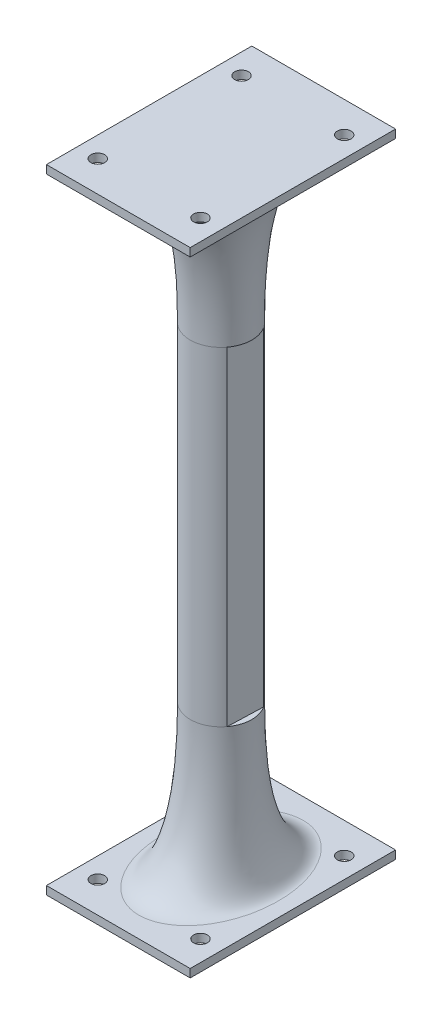
ISO-10303-21;
HEADER;
FILE_DESCRIPTION(('STEP AP214'),'2;1');
FILE_NAME('part.step','',(''),(''),'','','');
FILE_SCHEMA(('AUTOMOTIVE_DESIGN { 1 0 10303 214 1 1 1 1 }'));
ENDSEC;
DATA;
#1=APPLICATION_CONTEXT('core data for automotive mechanical design processes');
#2=APPLICATION_PROTOCOL_DEFINITION('international standard','automotive_design',2000,#1);
#3=PRODUCT_CONTEXT('',#1,'mechanical');
#4=PRODUCT('Part','Part','',(#3));
#5=PRODUCT_RELATED_PRODUCT_CATEGORY('part','',(#4));
#6=PRODUCT_DEFINITION_FORMATION('','',#4);
#7=PRODUCT_DEFINITION_CONTEXT('part definition',#1,'design');
#8=PRODUCT_DEFINITION('design','',#6,#7);
#9=PRODUCT_DEFINITION_SHAPE('','',#8);
#10=(LENGTH_UNIT() NAMED_UNIT(*) SI_UNIT(.MILLI.,.METRE.));
#11=(NAMED_UNIT(*) PLANE_ANGLE_UNIT() SI_UNIT($,.RADIAN.));
#12=(NAMED_UNIT(*) SI_UNIT($,.STERADIAN.) SOLID_ANGLE_UNIT());
#13=UNCERTAINTY_MEASURE_WITH_UNIT(LENGTH_MEASURE(1.E-05),#10,'distance_accuracy_value','');
#14=(GEOMETRIC_REPRESENTATION_CONTEXT(3) GLOBAL_UNCERTAINTY_ASSIGNED_CONTEXT((#13)) GLOBAL_UNIT_ASSIGNED_CONTEXT((#10,
#11,#12)) REPRESENTATION_CONTEXT('',''));
#15=CARTESIAN_POINT('',(0.,0.,0.));
#16=DIRECTION('',(0.,0.,1.));
#17=DIRECTION('',(1.,0.,0.));
#18=AXIS2_PLACEMENT_3D('',#15,#16,#17);
#19=CARTESIAN_POINT('',(0.,77.,0.));
#20=DIRECTION('',(0.,-1.,0.));
#21=DIRECTION('',(0.,0.,-1.));
#22=AXIS2_PLACEMENT_3D('',#19,#20,#21);
#23=CYLINDRICAL_SURFACE('',#22,7.5);
#24=DIRECTION('',(0.,1.,0.));
#25=VECTOR('',#24,1.);
#26=CARTESIAN_POINT('',(6.00000000000016,-6.70935965365545,4.49999999999978));
#27=LINE('',#26,#25);
#28=CARTESIAN_POINT('',(5.99835042648636,37.,4.50118253100853));
#29=VERTEX_POINT('',#28);
#30=CARTESIAN_POINT('',(5.99835042648636,117.,4.50118253100853));
#31=VERTEX_POINT('',#30);
#32=EDGE_CURVE('E188',#29,#31,#27,.T.);
#33=ORIENTED_EDGE('',*,*,#32,.T.);
#34=CARTESIAN_POINT('',(0.347546737118989,117.,7.49194309011474));
#35=CARTESIAN_POINT('',(0.554292529365187,117.,7.48235227707145));
#36=CARTESIAN_POINT('',(0.963116018477651,117.,7.44656594368198));
#37=CARTESIAN_POINT('',(1.56050234554119,117.,7.34509640919193));
#38=CARTESIAN_POINT('',(2.14019514553421,117.,7.19786092779885));
#39=CARTESIAN_POINT('',(5.50112306027701,117.,6.05199688303917));
#40=CARTESIAN_POINT('',(7.64539609880735,117.,2.96038593882019));
#41=CARTESIAN_POINT('',(7.30012682924897,117.,-4.48246258204297));
#42=CARTESIAN_POINT('',(3.78736910780499,117.,-7.6837593509805));
#43=CARTESIAN_POINT('',(-4.48246258204297,117.,-7.30012682924897));
#44=CARTESIAN_POINT('',(-7.6837593509805,117.,-3.78736910780499));
#45=CARTESIAN_POINT('',(-7.33849008142212,117.,3.65547941305817));
#46=CARTESIAN_POINT('',(-4.91720606649304,117.,6.53529690957277));
#47=CARTESIAN_POINT('',(-1.46462876505931,117.,7.36508654242857));
#48=CARTESIAN_POINT('',(-0.873794580459681,117.,7.45802198052024));
#49=CARTESIAN_POINT('',(-0.269579849002208,117.,7.50374996409558));
#50=CARTESIAN_POINT('',(0.14080094487279,117.,7.50153390315802));
#51=CARTESIAN_POINT('',(0.347546737118989,117.,7.49194309011474));
#52=B_SPLINE_CURVE_WITH_KNOTS('',3,(#34,#35,#36,#37,#38,#39,#40,#41,#42,#43,#44,#45,#46,#47,#48,
#49,#50,#51),.UNSPECIFIED.,.T.,.F.,(4,1,1,1,1,2,2,2,1,1,1,1,4),(0.,0.0125,0.0249999999999999,
0.0375000000000001,0.05,0.25,0.5,0.75,0.95,0.9625,0.975,0.9875,1.),.UNSPECIFIED.);
#53=CARTESIAN_POINT('',(6.29367200133954,117.,-4.07923195769015));
#54=VERTEX_POINT('',#53);
#55=EDGE_CURVE('E202',#54,#31,#52,.T.);
#56=ORIENTED_EDGE('',*,*,#55,.F.);
#57=DIRECTION('',(0.,1.,0.));
#58=VECTOR('',#57,1.);
#59=CARTESIAN_POINT('',(6.29364739917343,-6.70935965365545,-4.079215906872));
#60=LINE('',#59,#58);
#61=CARTESIAN_POINT('',(6.29367200133954,37.,-4.07923195769015));
#62=VERTEX_POINT('',#61);
#63=EDGE_CURVE('E179',#62,#54,#60,.T.);
#64=ORIENTED_EDGE('',*,*,#63,.F.);
#65=CARTESIAN_POINT('',(0.,37.,0.));
#66=DIRECTION('',(0.,1.,0.));
#67=DIRECTION('',(0.,0.,1.));
#68=AXIS2_PLACEMENT_3D('',#65,#66,#67);
#69=CIRCLE('',#68,7.5);
#70=EDGE_CURVE('E100',#62,#29,#69,.T.);
#71=ORIENTED_EDGE('',*,*,#70,.T.);
#72=EDGE_LOOP('',(#33,#56,#64,#71));
#73=FACE_BOUND('',#72,.T.);
#74=ADVANCED_FACE('F91',(#73),#23,.T.);
#75=CARTESIAN_POINT('',(-0.239361653243309,2.,19.9970766230281));
#76=CARTESIAN_POINT('',(-0.194900534208958,2.,18.1770053121313));
#77=CARTESIAN_POINT('',(0.347546737118989,3.54562077740665,7.49194309011474));
#78=CARTESIAN_POINT('',(0.347546737118989,37.,7.49194309011474));
#79=CARTESIAN_POINT('',(0.146922382755795,2.,20.0065128579728));
#80=CARTESIAN_POINT('',(0.12055254740084,2.,18.1844203422382));
#81=CARTESIAN_POINT('',(0.554292529365187,3.54242986405842,7.48235227707145));
#82=CARTESIAN_POINT('',(0.554292529365187,37.,7.48235227707145));
#83=CARTESIAN_POINT('',(0.912759687554871,2.,19.9804058575668));
#84=CARTESIAN_POINT('',(0.745996902826354,2.,18.1640755567274));
#85=CARTESIAN_POINT('',(0.963116018477651,3.54219328401773,7.44656594368198));
#86=CARTESIAN_POINT('',(0.963116018477651,37.,7.44656594368198));
#87=CARTESIAN_POINT('',(2.03764739324277,2.,19.8113817285791));
#88=CARTESIAN_POINT('',(1.66558078654985,2.,18.0317426474941));
#89=CARTESIAN_POINT('',(1.56050234554119,3.55991363590714,7.34509640919193));
#90=CARTESIAN_POINT('',(1.56050234554119,37.,7.34509640919193));
#91=CARTESIAN_POINT('',(3.13499089750662,2.,19.51756875372));
#92=CARTESIAN_POINT('',(2.57105150628861,2.,17.7983320551637));
#93=CARTESIAN_POINT('',(2.14019514553421,3.59480360694861,7.19786092779885));
#94=CARTESIAN_POINT('',(2.14019514553421,37.,7.19786092779885));
#95=CARTESIAN_POINT('',(9.53173101506544,2.,17.0364065243815));
#96=CARTESIAN_POINT('',(7.9286029257289,2.,15.8185927378217));
#97=CARTESIAN_POINT('',(5.50112306027701,3.89755737688528,6.05199688303917));
#98=CARTESIAN_POINT('',(5.50112306027701,37.,6.05199688303917));
#99=CARTESIAN_POINT('',(13.8922678047397,2.,9.17129461318427));
#100=CARTESIAN_POINT('',(12.1378154535903,2.,8.50187874577093));
#101=CARTESIAN_POINT('',(7.64539609880735,4.92554845236295,2.96038593882019));
#102=CARTESIAN_POINT('',(7.64539609880735,37.,2.96038593882019));
#103=CARTESIAN_POINT('',(14.1300609253447,2.,-10.6947415239126));
#104=CARTESIAN_POINT('',(12.7279968794355,2.,-9.901771494181));
#105=CARTESIAN_POINT('',(7.30012682924897,4.99044989110801,-4.48246258204297));
#106=CARTESIAN_POINT('',(7.30012682924897,37.,-4.48246258204297));
#107=CARTESIAN_POINT('',(7.96504237322541,2.,-19.8083519241353));
#108=CARTESIAN_POINT('',(7.22599938800304,2.,-17.9938670511293));
#109=CARTESIAN_POINT('',(3.78736910780499,3.55982510795444,-7.6837593509805));
#110=CARTESIAN_POINT('',(3.78736910780499,37.,-7.6837593509805));
#111=CARTESIAN_POINT('',(-7.48631906673879,2.,-20.185801321921));
#112=CARTESIAN_POINT('',(-6.83867291607583,2.,-18.360194816183));
#113=CARTESIAN_POINT('',(-4.48246258204297,3.53141644685886,-7.30012682924897));
#114=CARTESIAN_POINT('',(-4.48246258204297,37.,-7.30012682924897));
#115=CARTESIAN_POINT('',(-13.8658463468947,2.,-11.3786319617506));
#116=CARTESIAN_POINT('',(-12.4945321210332,2.,-10.5634186665552));
#117=CARTESIAN_POINT('',(-7.6837593509805,4.93363256891686,-3.78736910780499));
#118=CARTESIAN_POINT('',(-7.6837593509805,37.,-3.78736910780499));
#119=CARTESIAN_POINT('',(-14.1036394674997,2.,8.48740417534624));
#120=CARTESIAN_POINT('',(-12.3245939598601,2.,7.87293851790129));
#121=CARTESIAN_POINT('',(-7.33849008142212,4.97100231011586,3.65547941305817));
#122=CARTESIAN_POINT('',(-7.33849008142212,37.,3.65547941305817));
#123=CARTESIAN_POINT('',(-9.93388509122683,2.,16.5608959937791));
#124=CARTESIAN_POINT('',(-8.30036228521085,2.,15.4182706097587));
#125=CARTESIAN_POINT('',(-4.91720606649304,4.04925962713558,6.53529690957277));
#126=CARTESIAN_POINT('',(-4.91720606649304,37.,6.53529690957277));
#127=CARTESIAN_POINT('',(-3.60026554530373,2.,19.3530383660161));
#128=CARTESIAN_POINT('',(-2.95663820492342,2.,17.6663172880339));
#129=CARTESIAN_POINT('',(-1.46462876505931,3.64932164517998,7.36508654242857));
#130=CARTESIAN_POINT('',(-1.46462876505931,37.,7.36508654242857));
#131=CARTESIAN_POINT('',(-2.5105953118666,2.,19.7002762135928));
#132=CARTESIAN_POINT('',(-2.05282748186925,2.,17.9437684218622));
#133=CARTESIAN_POINT('',(-0.873794580459681,3.5973829952733,7.45802198052024));
#134=CARTESIAN_POINT('',(-0.873794580459681,37.,7.45802198052024));
#135=CARTESIAN_POINT('',(-1.39041045040131,2.,19.9241434896876));
#136=CARTESIAN_POINT('',(-1.13218750879399,2.,18.1199404178743));
#137=CARTESIAN_POINT('',(-0.269579849002208,3.5613387641071,7.50374996409558));
#138=CARTESIAN_POINT('',(-0.269579849002208,37.,7.50374996409558));
#139=CARTESIAN_POINT('',(-0.625645689242413,2.,19.9876403880835));
#140=CARTESIAN_POINT('',(-0.510353615818757,2.,18.1695902820243));
#141=CARTESIAN_POINT('',(0.14080094487279,3.54881169075487,7.50153390315802));
#142=CARTESIAN_POINT('',(0.14080094487279,37.,7.50153390315802));
#143=CARTESIAN_POINT('',(-0.239361653243309,2.,19.9970766230281));
#144=CARTESIAN_POINT('',(-0.194900534208958,2.,18.1770053121313));
#145=CARTESIAN_POINT('',(0.347546737118989,3.54562077740665,7.49194309011474));
#146=CARTESIAN_POINT('',(0.347546737118989,37.,7.49194309011474));
#147=B_SPLINE_SURFACE_WITH_KNOTS('',3,3,((#75,#76,#77,#78),(#79,#80,#81,#82),(#83,#84,#85,#86),
(#87,#88,#89,#90),(#91,#92,#93,#94),(#95,#96,#97,#98),(#99,#100,#101,#102),(#103,#104,#105,
#106),(#107,#108,#109,#110),(#111,#112,#113,#114),(#115,#116,#117,#118),(#119,#120,#121,#122),
(#123,#124,#125,#126),(#127,#128,#129,#130),(#131,#132,#133,#134),(#135,#136,#137,#138),(#139,
#140,#141,#142),(#143,#144,#145,#146)),.UNSPECIFIED.,.T.,.F.,.F.,(4,1,1,1,1,2,2,2,1,1,1,1,4),(4,
4),(0.,0.0125,0.0249999999999999,0.0375000000000001,0.05,0.25,0.5,0.75,0.95,0.9625,0.975,0.9875,
1.),(0.,1.),.UNSPECIFIED.);
#148=CARTESIAN_POINT('',(0.,2.,0.));
#149=DIRECTION('',(0.,1.,0.));
#150=DIRECTION('',(0.,0.,-1.));
#151=AXIS2_PLACEMENT_3D('',#148,#149,#150);
#152=ELLIPSE('',#151,20.,14.);
#153=CARTESIAN_POINT('',(0.,2.,-20.));
#154=VERTEX_POINT('',#153);
#155=EDGE_CURVE('E440',#154,#154,#152,.F.);
#156=EDGE_CURVE('E14',#29,#62,#69,.T.);
#157=CARTESIAN_POINT('',(-0.239480364431131,2.,20.0019362134282));
#158=CARTESIAN_POINT('',(-0.23944079403519,2.,20.0003163499615));
#159=CARTESIAN_POINT('',(-0.239401223639249,2.,19.9986964864948));
#160=CARTESIAN_POINT('',(-0.239361653243309,2.,19.9970766230281));
#161=CARTESIAN_POINT('',(-0.194900534208958,2.,18.1770053121313));
#162=CARTESIAN_POINT('',(0.347546737118989,3.54562077740665,7.49194309011474));
#163=CARTESIAN_POINT('',(0.347546737118989,37.,7.49194309011474));
#164=CARTESIAN_POINT('',(0.146992790216193,2.,20.0113778449898));
#165=CARTESIAN_POINT('',(0.146969321062727,2.,20.0097561826508));
#166=CARTESIAN_POINT('',(0.146945851909261,2.,20.0081345203118));
#167=CARTESIAN_POINT('',(0.146922382755795,2.,20.0065128579728));
#168=CARTESIAN_POINT('',(0.12055254740084,2.,18.1844203422382));
#169=CARTESIAN_POINT('',(0.554292529365187,3.54242986405842,7.48235227707145));
#170=CARTESIAN_POINT('',(0.554292529365187,37.,7.48235227707145));
#171=CARTESIAN_POINT('',(0.913204944190097,2.,19.98525545947));
#172=CARTESIAN_POINT('',(0.913056525311688,2.,19.9836389255022));
#173=CARTESIAN_POINT('',(0.91290810643328,2.,19.9820223915345));
#174=CARTESIAN_POINT('',(0.912759687554871,2.,19.9804058575668));
#175=CARTESIAN_POINT('',(0.745996902826354,2.,18.1640755567274));
#176=CARTESIAN_POINT('',(0.963116018477651,3.54219328401773,7.44656594368198));
#177=CARTESIAN_POINT('',(0.963116018477651,37.,7.44656594368198));
#178=CARTESIAN_POINT('',(2.03864081108264,2.,19.8161333649256));
#179=CARTESIAN_POINT('',(2.03830967180268,2.,19.8145494861434));
#180=CARTESIAN_POINT('',(2.03797853252273,2.,19.8129656073612));
#181=CARTESIAN_POINT('',(2.03764739324277,2.,19.8113817285791));
#182=CARTESIAN_POINT('',(1.66558078654985,2.,18.0317426474941));
#183=CARTESIAN_POINT('',(1.56050234554119,3.55991363590714,7.34509640919193));
#184=CARTESIAN_POINT('',(1.56050234554119,37.,7.34509640919193));
#185=CARTESIAN_POINT('',(3.13649661568117,2.,19.5221591157052));
#186=CARTESIAN_POINT('',(3.13599470962299,2.,19.5206289950434));
#187=CARTESIAN_POINT('',(3.13549280356481,2.,19.5190988743817));
#188=CARTESIAN_POINT('',(3.13499089750662,2.,19.51756875372));
#189=CARTESIAN_POINT('',(2.57105150628861,2.,17.7983320551637));
#190=CARTESIAN_POINT('',(2.14019514553421,3.59480360694861,7.19786092779885));
#191=CARTESIAN_POINT('',(2.14019514553421,37.,7.19786092779885));
#192=CARTESIAN_POINT('',(9.53601136706397,2.,17.0396580871916));
#193=CARTESIAN_POINT('',(9.53458458306446,2.,17.0385742329216));
#194=CARTESIAN_POINT('',(9.53315779906495,2.,17.0374903786515));
#195=CARTESIAN_POINT('',(9.53173101506544,2.,17.0364065243815));
#196=CARTESIAN_POINT('',(7.9286029257289,2.,15.8185927378217));
#197=CARTESIAN_POINT('',(5.50112306027701,3.89755737688528,6.05199688303917));
#198=CARTESIAN_POINT('',(5.50112306027701,37.,6.05199688303917));
#199=CARTESIAN_POINT('',(13.8969521925173,2.,9.17308195355026));
#200=CARTESIAN_POINT('',(13.8953907299248,2.,9.17248617342826));
#201=CARTESIAN_POINT('',(13.8938292673322,2.,9.17189039330627));
#202=CARTESIAN_POINT('',(13.8922678047397,2.,9.17129461318427));
#203=CARTESIAN_POINT('',(12.1378154535903,2.,8.50187874577093));
#204=CARTESIAN_POINT('',(7.64539609880735,4.92554845236295,2.96038593882019));
#205=CARTESIAN_POINT('',(7.64539609880735,37.,2.96038593882019));
#206=CARTESIAN_POINT('',(14.1338044363473,2.,-10.6968587538919));
#207=CARTESIAN_POINT('',(14.1325565993464,2.,-10.6961530105655));
#208=CARTESIAN_POINT('',(14.1313087623455,2.,-10.695447267239));
#209=CARTESIAN_POINT('',(14.1300609253447,2.,-10.6947415239126));
#210=CARTESIAN_POINT('',(12.7279968794355,2.,-9.901771494181));
#211=CARTESIAN_POINT('',(7.30012682924897,4.99044989110801,-4.48246258204297));
#212=CARTESIAN_POINT('',(7.30012682924897,37.,-4.48246258204297));
#213=CARTESIAN_POINT('',(7.96701561799595,2.,-19.8131965987462));
#214=CARTESIAN_POINT('',(7.96635786973911,2.,-19.8115817072092));
#215=CARTESIAN_POINT('',(7.96570012148226,2.,-19.8099668156723));
#216=CARTESIAN_POINT('',(7.96504237322541,2.,-19.8083519241353));
#217=CARTESIAN_POINT('',(7.22599938800304,2.,-17.9938670511293));
#218=CARTESIAN_POINT('',(3.78736910780499,3.55982510795444,-7.6837593509805));
#219=CARTESIAN_POINT('',(3.78736910780499,37.,-7.6837593509805));
#220=CARTESIAN_POINT('',(-7.48804828196106,2.,-20.1906756912913));
#221=CARTESIAN_POINT('',(-7.48747187688697,2.,-20.1890509015012));
#222=CARTESIAN_POINT('',(-7.48689547181288,2.,-20.1874261117111));
#223=CARTESIAN_POINT('',(-7.48631906673879,2.,-20.185801321921));
#224=CARTESIAN_POINT('',(-6.83867291607583,2.,-18.360194816183));
#225=CARTESIAN_POINT('',(-4.48246258204297,3.53141644685886,-7.30012682924897));
#226=CARTESIAN_POINT('',(-4.48246258204297,37.,-7.30012682924897));
#227=CARTESIAN_POINT('',(-13.8695077558778,2.,-11.3808085812488));
#228=CARTESIAN_POINT('',(-13.8682872862167,2.,-11.380083041416));
#229=CARTESIAN_POINT('',(-13.8670668165557,2.,-11.3793575015833));
#230=CARTESIAN_POINT('',(-13.8658463468947,2.,-11.3786319617506));
#231=CARTESIAN_POINT('',(-12.4945321210332,2.,-10.5634186665552));
#232=CARTESIAN_POINT('',(-7.6837593509805,4.93363256891686,-3.78736910780499));
#233=CARTESIAN_POINT('',(-7.6837593509805,37.,-3.78736910780499));
#234=CARTESIAN_POINT('',(-14.1083895190051,2.,8.48904479865161));
#235=CARTESIAN_POINT('',(-14.1068061685033,2.,8.48849792421649));
#236=CARTESIAN_POINT('',(-14.1052228180015,2.,8.48795104978136));
#237=CARTESIAN_POINT('',(-14.1036394674997,2.,8.48740417534624));
#238=CARTESIAN_POINT('',(-12.3245939598601,2.,7.87293851790129));
#239=CARTESIAN_POINT('',(-7.33849008142212,4.97100231011586,3.65547941305817));
#240=CARTESIAN_POINT('',(-7.33849008142212,37.,3.65547941305817));
#241=CARTESIAN_POINT('',(-9.93824659711889,2.,16.5639468035544));
#242=CARTESIAN_POINT('',(-9.93679276182154,2.,16.5629298669626));
#243=CARTESIAN_POINT('',(-9.93533892652419,2.,16.5619129303708));
#244=CARTESIAN_POINT('',(-9.93388509122683,2.,16.5608959937791));
#245=CARTESIAN_POINT('',(-8.30036228521085,2.,15.4182706097587));
#246=CARTESIAN_POINT('',(-4.91720606649304,4.04925962713558,6.53529690957277));
#247=CARTESIAN_POINT('',(-4.91720606649304,37.,6.53529690957277));
#248=CARTESIAN_POINT('',(-3.60198403030254,2.,19.3575419112943));
#249=CARTESIAN_POINT('',(-3.60141120196961,2.,19.3560407295349));
#250=CARTESIAN_POINT('',(-3.60083837363667,2.,19.3545395477755));
#251=CARTESIAN_POINT('',(-3.60026554530373,2.,19.3530383660161));
#252=CARTESIAN_POINT('',(-2.95663820492342,2.,17.6663172880339));
#253=CARTESIAN_POINT('',(-1.46462876505931,3.64932164517998,7.36508654242857));
#254=CARTESIAN_POINT('',(-1.46462876505931,37.,7.36508654242857));
#255=CARTESIAN_POINT('',(-2.51181755197269,2.,19.7049660893967));
#256=CARTESIAN_POINT('',(-2.51141013860399,2.,19.703402797462));
#257=CARTESIAN_POINT('',(-2.5110027252353,2.,19.7018395055274));
#258=CARTESIAN_POINT('',(-2.5105953118666,2.,19.7002762135928));
#259=CARTESIAN_POINT('',(-2.05282748186925,2.,17.9437684218622));
#260=CARTESIAN_POINT('',(-0.873794580459681,3.5973829952733,7.45802198052024));
#261=CARTESIAN_POINT('',(-0.873794580459681,37.,7.45802198052024));
#262=CARTESIAN_POINT('',(-1.3910999056554,2.,19.9289607118893));
#263=CARTESIAN_POINT('',(-1.39087008723737,2.,19.9273549711554));
#264=CARTESIAN_POINT('',(-1.39064026881934,2.,19.9257492304215));
#265=CARTESIAN_POINT('',(-1.39041045040131,2.,19.9241434896876));
#266=CARTESIAN_POINT('',(-1.13218750879399,2.,18.1199404178743));
#267=CARTESIAN_POINT('',(-0.269579849002208,3.5613387641071,7.50374996409558));
#268=CARTESIAN_POINT('',(-0.269579849002208,37.,7.50374996409558));
#269=CARTESIAN_POINT('',(-0.625953519078454,2.,19.9924945818667));
#270=CARTESIAN_POINT('',(-0.625850909133107,2.,19.9908765172723));
#271=CARTESIAN_POINT('',(-0.62574829918776,2.,19.9892584526779));
#272=CARTESIAN_POINT('',(-0.625645689242413,2.,19.9876403880835));
#273=CARTESIAN_POINT('',(-0.510353615818757,2.,18.1695902820243));
#274=CARTESIAN_POINT('',(0.14080094487279,3.54881169075487,7.50153390315802));
#275=CARTESIAN_POINT('',(0.14080094487279,37.,7.50153390315802));
#276=CARTESIAN_POINT('',(-0.239480364431131,2.,20.0019362134282));
#277=CARTESIAN_POINT('',(-0.23944079403519,2.,20.0003163499615));
#278=CARTESIAN_POINT('',(-0.239401223639249,2.,19.9986964864948));
#279=CARTESIAN_POINT('',(-0.239361653243309,2.,19.9970766230281));
#280=CARTESIAN_POINT('',(-0.194900534208958,2.,18.1770053121313));
#281=CARTESIAN_POINT('',(0.347546737118989,3.54562077740665,7.49194309011474));
#282=CARTESIAN_POINT('',(0.347546737118989,37.,7.49194309011474));
#283=B_SPLINE_SURFACE_WITH_KNOTS('',3,3,((#157,#158,#159,#160,#161,#162,#163),(#164,#165,#166,
#167,#168,#169,#170),(#171,#172,#173,#174,#175,#176,#177),(#178,#179,#180,#181,#182,#183,#184),
(#185,#186,#187,#188,#189,#190,#191),(#192,#193,#194,#195,#196,#197,#198),(#199,#200,#201,#202,
#203,#204,#205),(#206,#207,#208,#209,#210,#211,#212),(#213,#214,#215,#216,#217,#218,#219),(#220,
#221,#222,#223,#224,#225,#226),(#227,#228,#229,#230,#231,#232,#233),(#234,#235,#236,#237,#238,
#239,#240),(#241,#242,#243,#244,#245,#246,#247),(#248,#249,#250,#251,#252,#253,#254),(#255,#256,
#257,#258,#259,#260,#261),(#262,#263,#264,#265,#266,#267,#268),(#269,#270,#271,#272,#273,#274,
#275),(#276,#277,#278,#279,#280,#281,#282)),.UNSPECIFIED.,.T.,.F.,.F.,(4,1,1,1,1,2,2,2,1,1,1,1,
4),(4,3,4),(0.,0.0125,0.0249999999999999,0.0375000000000001,0.05,0.25,0.5,0.75,0.95,0.9625,
0.975,0.9875,1.),(-0.00089,0.,1.),.UNSPECIFIED.);
#284=ORIENTED_EDGE('',*,*,#155,.F.);
#285=EDGE_LOOP('',(#284));
#286=FACE_BOUND('',#285,.T.);
#287=ORIENTED_EDGE('',*,*,#156,.F.);
#288=ORIENTED_EDGE('',*,*,#70,.F.);
#289=EDGE_LOOP('',(#287,#288));
#290=FACE_BOUND('',#289,.T.);
#291=ADVANCED_FACE('F370',(#286,#290),#283,.T.);
#292=CARTESIAN_POINT('',(0.,2.,0.));
#293=DIRECTION('',(0.,1.,0.));
#294=DIRECTION('',(0.,0.,1.));
#295=AXIS2_PLACEMENT_3D('',#292,#293,#294);
#296=PLANE('',#295);
#297=CARTESIAN_POINT('',(12.5,2.,17.5));
#298=DIRECTION('',(0.,1.,0.));
#299=DIRECTION('',(0.,0.,1.));
#300=AXIS2_PLACEMENT_3D('',#297,#298,#299);
#301=CIRCLE('',#300,1.675);
#302=CARTESIAN_POINT('',(12.5,2.,19.175));
#303=VERTEX_POINT('',#302);
#304=EDGE_CURVE('E197',#303,#303,#301,.T.);
#305=ORIENTED_EDGE('',*,*,#304,.F.);
#306=EDGE_LOOP('',(#305));
#307=FACE_BOUND('',#306,.T.);
#308=CARTESIAN_POINT('',(12.5,2.,-17.5));
#309=DIRECTION('',(0.,1.,0.));
#310=DIRECTION('',(0.,0.,1.));
#311=AXIS2_PLACEMENT_3D('',#308,#309,#310);
#312=CIRCLE('',#311,1.675);
#313=CARTESIAN_POINT('',(12.5,2.,-15.825));
#314=VERTEX_POINT('',#313);
#315=EDGE_CURVE('E235',#314,#314,#312,.T.);
#316=ORIENTED_EDGE('',*,*,#315,.F.);
#317=EDGE_LOOP('',(#316));
#318=FACE_BOUND('',#317,.T.);
#319=CARTESIAN_POINT('',(-12.5,2.,-17.5));
#320=DIRECTION('',(0.,1.,0.));
#321=DIRECTION('',(0.,0.,1.));
#322=AXIS2_PLACEMENT_3D('',#319,#320,#321);
#323=CIRCLE('',#322,1.675);
#324=CARTESIAN_POINT('',(-12.5,2.,-15.825));
#325=VERTEX_POINT('',#324);
#326=EDGE_CURVE('E231',#325,#325,#323,.T.);
#327=ORIENTED_EDGE('',*,*,#326,.F.);
#328=EDGE_LOOP('',(#327));
#329=FACE_BOUND('',#328,.T.);
#330=CARTESIAN_POINT('',(-12.5,2.,17.5));
#331=DIRECTION('',(0.,1.,0.));
#332=DIRECTION('',(0.,0.,1.));
#333=AXIS2_PLACEMENT_3D('',#330,#331,#332);
#334=CIRCLE('',#333,1.675);
#335=CARTESIAN_POINT('',(-12.5,2.,19.175));
#336=VERTEX_POINT('',#335);
#337=EDGE_CURVE('E227',#336,#336,#334,.T.);
#338=ORIENTED_EDGE('',*,*,#337,.F.);
#339=EDGE_LOOP('',(#338));
#340=FACE_BOUND('',#339,.T.);
#341=DIRECTION('',(0.,0.,-1.));
#342=VECTOR('',#341,1.);
#343=CARTESIAN_POINT('',(17.5,2.,-25.));
#344=LINE('',#343,#342);
#345=CARTESIAN_POINT('',(17.5,2.,25.));
#346=VERTEX_POINT('',#345);
#347=CARTESIAN_POINT('',(17.5,2.,-25.));
#348=VERTEX_POINT('',#347);
#349=EDGE_CURVE('E484',#346,#348,#344,.T.);
#350=ORIENTED_EDGE('',*,*,#349,.T.);
#351=DIRECTION('',(-1.,0.,0.));
#352=VECTOR('',#351,1.);
#353=CARTESIAN_POINT('',(-17.5,2.,-25.));
#354=LINE('',#353,#352);
#355=CARTESIAN_POINT('',(-17.5,2.,-25.));
#356=VERTEX_POINT('',#355);
#357=EDGE_CURVE('E144',#348,#356,#354,.T.);
#358=ORIENTED_EDGE('',*,*,#357,.T.);
#359=DIRECTION('',(0.,0.,1.));
#360=VECTOR('',#359,1.);
#361=CARTESIAN_POINT('',(-17.5,2.,-25.));
#362=LINE('',#361,#360);
#363=CARTESIAN_POINT('',(-17.5,2.,25.));
#364=VERTEX_POINT('',#363);
#365=EDGE_CURVE('E480',#356,#364,#362,.T.);
#366=ORIENTED_EDGE('',*,*,#365,.T.);
#367=DIRECTION('',(1.,0.,0.));
#368=VECTOR('',#367,1.);
#369=CARTESIAN_POINT('',(-17.5,2.,25.));
#370=LINE('',#369,#368);
#371=EDGE_CURVE('E115',#364,#346,#370,.T.);
#372=ORIENTED_EDGE('',*,*,#371,.T.);
#373=EDGE_LOOP('',(#350,#358,#366,#372));
#374=FACE_BOUND('',#373,.T.);
#375=ORIENTED_EDGE('',*,*,#155,.T.);
#376=EDGE_LOOP('',(#375));
#377=FACE_BOUND('',#376,.T.);
#378=ADVANCED_FACE('F374',(#307,#318,#329,#340,#374,#377),#296,.T.);
#379=CARTESIAN_POINT('',(17.5,2.,-25.));
#380=DIRECTION('',(-1.,0.,0.));
#381=DIRECTION('',(0.,0.,1.));
#382=AXIS2_PLACEMENT_3D('',#379,#380,#381);
#383=PLANE('',#382);
#384=DIRECTION('',(0.,0.,-1.));
#385=VECTOR('',#384,1.);
#386=CARTESIAN_POINT('',(17.5,0.,-25.));
#387=LINE('',#386,#385);
#388=CARTESIAN_POINT('',(17.5,0.,25.));
#389=VERTEX_POINT('',#388);
#390=CARTESIAN_POINT('',(17.5,0.,-25.));
#391=VERTEX_POINT('',#390);
#392=EDGE_CURVE('E477',#389,#391,#387,.T.);
#393=ORIENTED_EDGE('',*,*,#392,.T.);
#394=DIRECTION('',(0.,-1.,0.));
#395=VECTOR('',#394,1.);
#396=CARTESIAN_POINT('',(17.5,2.,-25.));
#397=LINE('',#396,#395);
#398=EDGE_CURVE('E471',#348,#391,#397,.T.);
#399=ORIENTED_EDGE('',*,*,#398,.F.);
#400=ORIENTED_EDGE('',*,*,#349,.F.);
#401=DIRECTION('',(0.,-1.,0.));
#402=VECTOR('',#401,1.);
#403=CARTESIAN_POINT('',(17.5,2.,25.));
#404=LINE('',#403,#402);
#405=EDGE_CURVE('E488',#346,#389,#404,.T.);
#406=ORIENTED_EDGE('',*,*,#405,.T.);
#407=EDGE_LOOP('',(#393,#399,#400,#406));
#408=FACE_BOUND('',#407,.T.);
#409=ADVANCED_FACE('F379',(#408),#383,.F.);
#410=CARTESIAN_POINT('',(-17.5,2.,-25.));
#411=DIRECTION('',(0.,0.,1.));
#412=DIRECTION('',(1.,0.,0.));
#413=AXIS2_PLACEMENT_3D('',#410,#411,#412);
#414=PLANE('',#413);
#415=DIRECTION('',(-1.,0.,0.));
#416=VECTOR('',#415,1.);
#417=CARTESIAN_POINT('',(-17.5,0.,-25.));
#418=LINE('',#417,#416);
#419=CARTESIAN_POINT('',(-17.5,0.,-25.));
#420=VERTEX_POINT('',#419);
#421=EDGE_CURVE('E466',#391,#420,#418,.T.);
#422=ORIENTED_EDGE('',*,*,#421,.T.);
#423=DIRECTION('',(0.,-1.,0.));
#424=VECTOR('',#423,1.);
#425=CARTESIAN_POINT('',(-17.5,2.,-25.));
#426=LINE('',#425,#424);
#427=EDGE_CURVE('E468',#356,#420,#426,.T.);
#428=ORIENTED_EDGE('',*,*,#427,.F.);
#429=ORIENTED_EDGE('',*,*,#357,.F.);
#430=ORIENTED_EDGE('',*,*,#398,.T.);
#431=EDGE_LOOP('',(#422,#428,#429,#430));
#432=FACE_BOUND('',#431,.T.);
#433=ADVANCED_FACE('F459',(#432),#414,.F.);
#434=CARTESIAN_POINT('',(-17.5,2.,-25.));
#435=DIRECTION('',(1.,0.,0.));
#436=DIRECTION('',(0.,0.,-1.));
#437=AXIS2_PLACEMENT_3D('',#434,#435,#436);
#438=PLANE('',#437);
#439=DIRECTION('',(0.,0.,1.));
#440=VECTOR('',#439,1.);
#441=CARTESIAN_POINT('',(-17.5,0.,-25.));
#442=LINE('',#441,#440);
#443=CARTESIAN_POINT('',(-17.5,0.,25.));
#444=VERTEX_POINT('',#443);
#445=EDGE_CURVE('E476',#420,#444,#442,.T.);
#446=ORIENTED_EDGE('',*,*,#445,.T.);
#447=DIRECTION('',(0.,-1.,0.));
#448=VECTOR('',#447,1.);
#449=CARTESIAN_POINT('',(-17.5,2.,25.));
#450=LINE('',#449,#448);
#451=EDGE_CURVE('E481',#364,#444,#450,.T.);
#452=ORIENTED_EDGE('',*,*,#451,.F.);
#453=ORIENTED_EDGE('',*,*,#365,.F.);
#454=ORIENTED_EDGE('',*,*,#427,.T.);
#455=EDGE_LOOP('',(#446,#452,#453,#454));
#456=FACE_BOUND('',#455,.T.);
#457=ADVANCED_FACE('F457',(#456),#438,.F.);
#458=CARTESIAN_POINT('',(-17.5,2.,25.));
#459=DIRECTION('',(0.,0.,-1.));
#460=DIRECTION('',(-1.,0.,0.));
#461=AXIS2_PLACEMENT_3D('',#458,#459,#460);
#462=PLANE('',#461);
#463=DIRECTION('',(1.,0.,0.));
#464=VECTOR('',#463,1.);
#465=CARTESIAN_POINT('',(-17.5,0.,25.));
#466=LINE('',#465,#464);
#467=EDGE_CURVE('E136',#444,#389,#466,.T.);
#468=ORIENTED_EDGE('',*,*,#467,.T.);
#469=ORIENTED_EDGE('',*,*,#405,.F.);
#470=ORIENTED_EDGE('',*,*,#371,.F.);
#471=ORIENTED_EDGE('',*,*,#451,.T.);
#472=EDGE_LOOP('',(#468,#469,#470,#471));
#473=FACE_BOUND('',#472,.T.);
#474=ADVANCED_FACE('F453',(#473),#462,.F.);
#475=CARTESIAN_POINT('',(0.,0.,0.));
#476=DIRECTION('',(0.,1.,0.));
#477=DIRECTION('',(0.,0.,1.));
#478=AXIS2_PLACEMENT_3D('',#475,#476,#477);
#479=PLANE('',#478);
#480=CARTESIAN_POINT('',(12.5,0.,17.5));
#481=DIRECTION('',(0.,-1.,0.));
#482=DIRECTION('',(0.,0.,-1.));
#483=AXIS2_PLACEMENT_3D('',#480,#481,#482);
#484=CIRCLE('',#483,1.675);
#485=CARTESIAN_POINT('',(12.5,0.,15.825));
#486=VERTEX_POINT('',#485);
#487=EDGE_CURVE('E790',#486,#486,#484,.T.);
#488=ORIENTED_EDGE('',*,*,#487,.F.);
#489=EDGE_LOOP('',(#488));
#490=FACE_BOUND('',#489,.T.);
#491=CARTESIAN_POINT('',(12.5,0.,-17.5));
#492=DIRECTION('',(0.,-1.,0.));
#493=DIRECTION('',(0.,0.,-1.));
#494=AXIS2_PLACEMENT_3D('',#491,#492,#493);
#495=CIRCLE('',#494,1.675);
#496=CARTESIAN_POINT('',(12.5,0.,-19.175));
#497=VERTEX_POINT('',#496);
#498=EDGE_CURVE('E791',#497,#497,#495,.T.);
#499=ORIENTED_EDGE('',*,*,#498,.F.);
#500=EDGE_LOOP('',(#499));
#501=FACE_BOUND('',#500,.T.);
#502=CARTESIAN_POINT('',(-12.5,0.,-17.5));
#503=DIRECTION('',(0.,-1.,0.));
#504=DIRECTION('',(0.,0.,-1.));
#505=AXIS2_PLACEMENT_3D('',#502,#503,#504);
#506=CIRCLE('',#505,1.675);
#507=CARTESIAN_POINT('',(-12.5,0.,-19.175));
#508=VERTEX_POINT('',#507);
#509=EDGE_CURVE('E794',#508,#508,#506,.T.);
#510=ORIENTED_EDGE('',*,*,#509,.F.);
#511=EDGE_LOOP('',(#510));
#512=FACE_BOUND('',#511,.T.);
#513=CARTESIAN_POINT('',(-12.5,0.,17.5));
#514=DIRECTION('',(0.,-1.,0.));
#515=DIRECTION('',(0.,0.,-1.));
#516=AXIS2_PLACEMENT_3D('',#513,#514,#515);
#517=CIRCLE('',#516,1.675);
#518=CARTESIAN_POINT('',(-12.5,0.,15.825));
#519=VERTEX_POINT('',#518);
#520=EDGE_CURVE('E223',#519,#519,#517,.T.);
#521=ORIENTED_EDGE('',*,*,#520,.F.);
#522=EDGE_LOOP('',(#521));
#523=FACE_BOUND('',#522,.T.);
#524=ORIENTED_EDGE('',*,*,#392,.F.);
#525=ORIENTED_EDGE('',*,*,#467,.F.);
#526=ORIENTED_EDGE('',*,*,#445,.F.);
#527=ORIENTED_EDGE('',*,*,#421,.F.);
#528=EDGE_LOOP('',(#524,#525,#526,#527));
#529=FACE_BOUND('',#528,.T.);
#530=ADVANCED_FACE('F450',(#490,#501,#512,#523,#529),#479,.F.);
#531=CARTESIAN_POINT('',(6.00000000000016,-6.70935965365545,4.49999999999978));
#532=DIRECTION('',(-0.999414744186548,0.,-0.0342077345425852));
#533=DIRECTION('',(-0.0342077345425852,0.,0.999414744186548));
#534=AXIS2_PLACEMENT_3D('',#531,#532,#533);
#535=PLANE('',#534);
#536=DIRECTION('',(0.0342077345425852,0.,-0.999414744186548));
#537=VECTOR('',#536,1.);
#538=CARTESIAN_POINT('',(6.00000000000016,37.,4.49999999999978));
#539=LINE('',#538,#537);
#540=EDGE_CURVE('E106',#29,#62,#539,.T.);
#541=ORIENTED_EDGE('',*,*,#540,.T.);
#542=ORIENTED_EDGE('',*,*,#63,.T.);
#543=DIRECTION('',(0.0342077345425852,0.,-0.999414744186548));
#544=VECTOR('',#543,1.);
#545=CARTESIAN_POINT('',(6.00000000000016,117.,4.49999999999978));
#546=LINE('',#545,#544);
#547=EDGE_CURVE('E182',#31,#54,#546,.T.);
#548=ORIENTED_EDGE('',*,*,#547,.F.);
#549=ORIENTED_EDGE('',*,*,#32,.F.);
#550=EDGE_LOOP('',(#541,#542,#548,#549));
#551=FACE_BOUND('',#550,.T.);
#552=ADVANCED_FACE('F181',(#551),#535,.F.);
#553=CARTESIAN_POINT('',(0.,37.,0.));
#554=DIRECTION('',(0.,1.,0.));
#555=DIRECTION('',(0.,0.,1.));
#556=AXIS2_PLACEMENT_3D('',#553,#554,#555);
#557=PLANE('',#556);
#558=ORIENTED_EDGE('',*,*,#156,.T.);
#559=ORIENTED_EDGE('',*,*,#540,.F.);
#560=EDGE_LOOP('',(#558,#559));
#561=FACE_BOUND('',#560,.T.);
#562=ADVANCED_FACE('F306',(#561),#557,.T.);
#563=CARTESIAN_POINT('',(-0.239361653243309,152.,19.9970766230281));
#564=CARTESIAN_POINT('',(-0.194900534208958,152.,18.1770053121313));
#565=CARTESIAN_POINT('',(0.347546737118989,150.454379222593,7.49194309011474));
#566=CARTESIAN_POINT('',(0.347546737118989,117.,7.49194309011474));
#567=CARTESIAN_POINT('',(0.146922382755795,152.,20.0065128579728));
#568=CARTESIAN_POINT('',(0.12055254740084,152.,18.1844203422382));
#569=CARTESIAN_POINT('',(0.554292529365187,150.457570135942,7.48235227707145));
#570=CARTESIAN_POINT('',(0.554292529365187,117.,7.48235227707145));
#571=CARTESIAN_POINT('',(0.912759687554871,152.,19.9804058575668));
#572=CARTESIAN_POINT('',(0.745996902826354,152.,18.1640755567274));
#573=CARTESIAN_POINT('',(0.963116018477651,150.457806715982,7.44656594368198));
#574=CARTESIAN_POINT('',(0.963116018477651,117.,7.44656594368198));
#575=CARTESIAN_POINT('',(2.03764739324277,152.,19.8113817285791));
#576=CARTESIAN_POINT('',(1.66558078654985,152.,18.0317426474941));
#577=CARTESIAN_POINT('',(1.56050234554119,150.440086364093,7.34509640919193));
#578=CARTESIAN_POINT('',(1.56050234554119,117.,7.34509640919193));
#579=CARTESIAN_POINT('',(3.13499089750662,152.,19.51756875372));
#580=CARTESIAN_POINT('',(2.57105150628861,152.,17.7983320551637));
#581=CARTESIAN_POINT('',(2.14019514553421,150.405196393051,7.19786092779885));
#582=CARTESIAN_POINT('',(2.14019514553421,117.,7.19786092779885));
#583=CARTESIAN_POINT('',(9.53173101506544,152.,17.0364065243815));
#584=CARTESIAN_POINT('',(7.9286029257289,152.,15.8185927378217));
#585=CARTESIAN_POINT('',(5.50112306027701,150.102442623115,6.05199688303917));
#586=CARTESIAN_POINT('',(5.50112306027701,117.,6.05199688303917));
#587=CARTESIAN_POINT('',(13.8922678047397,152.,9.17129461318427));
#588=CARTESIAN_POINT('',(12.1378154535903,152.,8.50187874577093));
#589=CARTESIAN_POINT('',(7.64539609880735,149.074451547637,2.96038593882019));
#590=CARTESIAN_POINT('',(7.64539609880735,117.,2.96038593882019));
#591=CARTESIAN_POINT('',(14.1300609253447,152.,-10.6947415239126));
#592=CARTESIAN_POINT('',(12.7279968794355,152.,-9.901771494181));
#593=CARTESIAN_POINT('',(7.30012682924897,149.009550108892,-4.48246258204297));
#594=CARTESIAN_POINT('',(7.30012682924897,117.,-4.48246258204297));
#595=CARTESIAN_POINT('',(7.96504237322541,152.,-19.8083519241353));
#596=CARTESIAN_POINT('',(7.22599938800304,152.,-17.9938670511293));
#597=CARTESIAN_POINT('',(3.78736910780499,150.440174892046,-7.6837593509805));
#598=CARTESIAN_POINT('',(3.78736910780499,117.,-7.6837593509805));
#599=CARTESIAN_POINT('',(-7.48631906673879,152.,-20.185801321921));
#600=CARTESIAN_POINT('',(-6.83867291607583,152.,-18.360194816183));
#601=CARTESIAN_POINT('',(-4.48246258204297,150.468583553141,-7.30012682924897));
#602=CARTESIAN_POINT('',(-4.48246258204297,117.,-7.30012682924897));
#603=CARTESIAN_POINT('',(-13.8658463468947,152.,-11.3786319617506));
#604=CARTESIAN_POINT('',(-12.4945321210332,152.,-10.5634186665552));
#605=CARTESIAN_POINT('',(-7.6837593509805,149.066367431083,-3.78736910780499));
#606=CARTESIAN_POINT('',(-7.6837593509805,117.,-3.78736910780499));
#607=CARTESIAN_POINT('',(-14.1036394674997,152.,8.48740417534624));
#608=CARTESIAN_POINT('',(-12.3245939598601,152.,7.87293851790129));
#609=CARTESIAN_POINT('',(-7.33849008142212,149.028997689884,3.65547941305817));
#610=CARTESIAN_POINT('',(-7.33849008142212,117.,3.65547941305817));
#611=CARTESIAN_POINT('',(-9.93388509122683,152.,16.5608959937791));
#612=CARTESIAN_POINT('',(-8.30036228521085,152.,15.4182706097587));
#613=CARTESIAN_POINT('',(-4.91720606649304,149.950740372864,6.53529690957277));
#614=CARTESIAN_POINT('',(-4.91720606649304,117.,6.53529690957277));
#615=CARTESIAN_POINT('',(-3.60026554530373,152.,19.3530383660161));
#616=CARTESIAN_POINT('',(-2.95663820492342,152.,17.6663172880339));
#617=CARTESIAN_POINT('',(-1.46462876505931,150.35067835482,7.36508654242857));
#618=CARTESIAN_POINT('',(-1.46462876505931,117.,7.36508654242857));
#619=CARTESIAN_POINT('',(-2.5105953118666,152.,19.7002762135928));
#620=CARTESIAN_POINT('',(-2.05282748186925,152.,17.9437684218622));
#621=CARTESIAN_POINT('',(-0.873794580459681,150.402617004727,7.45802198052024));
#622=CARTESIAN_POINT('',(-0.873794580459681,117.,7.45802198052024));
#623=CARTESIAN_POINT('',(-1.39041045040131,152.,19.9241434896876));
#624=CARTESIAN_POINT('',(-1.13218750879399,152.,18.1199404178743));
#625=CARTESIAN_POINT('',(-0.269579849002208,150.438661235893,7.50374996409558));
#626=CARTESIAN_POINT('',(-0.269579849002208,117.,7.50374996409558));
#627=CARTESIAN_POINT('',(-0.625645689242413,152.,19.9876403880835));
#628=CARTESIAN_POINT('',(-0.510353615818757,152.,18.1695902820243));
#629=CARTESIAN_POINT('',(0.14080094487279,150.451188309245,7.50153390315802));
#630=CARTESIAN_POINT('',(0.14080094487279,117.,7.50153390315802));
#631=CARTESIAN_POINT('',(-0.239361653243309,152.,19.9970766230281));
#632=CARTESIAN_POINT('',(-0.194900534208958,152.,18.1770053121313));
#633=CARTESIAN_POINT('',(0.347546737118989,150.454379222593,7.49194309011474));
#634=CARTESIAN_POINT('',(0.347546737118989,117.,7.49194309011474));
#635=B_SPLINE_SURFACE_WITH_KNOTS('',3,3,((#563,#564,#565,#566),(#567,#568,#569,#570),(#571,#572,
#573,#574),(#575,#576,#577,#578),(#579,#580,#581,#582),(#583,#584,#585,#586),(#587,#588,#589,
#590),(#591,#592,#593,#594),(#595,#596,#597,#598),(#599,#600,#601,#602),(#603,#604,#605,#606),
(#607,#608,#609,#610),(#611,#612,#613,#614),(#615,#616,#617,#618),(#619,#620,#621,#622),(#623,
#624,#625,#626),(#627,#628,#629,#630),(#631,#632,#633,#634)),.UNSPECIFIED.,.T.,.F.,.F.,(4,1,1,1,
1,2,2,2,1,1,1,1,4),(4,4),(0.,0.0125,0.0249999999999999,0.0375000000000001,0.05,0.25,0.5,0.75,
0.95,0.9625,0.975,0.9875,1.),(0.,1.),.UNSPECIFIED.);
#636=CARTESIAN_POINT('',(-0.239361653243309,152.,19.9970766230281));
#637=CARTESIAN_POINT('',(-0.625645689242413,152.,19.9876403880835));
#638=CARTESIAN_POINT('',(-1.39041045040131,152.,19.9241434896876));
#639=CARTESIAN_POINT('',(-2.5105953118666,152.,19.7002762135928));
#640=CARTESIAN_POINT('',(-3.60026554530373,152.,19.3530383660161));
#641=CARTESIAN_POINT('',(-9.93388509122683,152.,16.5608959937791));
#642=CARTESIAN_POINT('',(-14.1036394674997,152.,8.48740417534624));
#643=CARTESIAN_POINT('',(-13.8658463468947,152.,-11.3786319617506));
#644=CARTESIAN_POINT('',(-7.48631906673879,152.,-20.185801321921));
#645=CARTESIAN_POINT('',(7.96504237322541,152.,-19.8083519241353));
#646=CARTESIAN_POINT('',(14.1300609253447,152.,-10.6947415239126));
#647=CARTESIAN_POINT('',(13.8922678047397,152.,9.17129461318427));
#648=CARTESIAN_POINT('',(9.53173101506544,152.,17.0364065243815));
#649=CARTESIAN_POINT('',(3.13499089750662,152.,19.51756875372));
#650=CARTESIAN_POINT('',(2.03764739324277,152.,19.8113817285791));
#651=CARTESIAN_POINT('',(0.912759687554871,152.,19.9804058575668));
#652=CARTESIAN_POINT('',(0.146922382755795,152.,20.0065128579728));
#653=CARTESIAN_POINT('',(-0.239361653243309,152.,19.9970766230281));
#654=B_SPLINE_CURVE_WITH_KNOTS('',3,(#636,#637,#638,#639,#640,#641,#642,#643,#644,#645,#646,
#647,#648,#649,#650,#651,#652,#653),.UNSPECIFIED.,.T.,.F.,(4,1,1,1,1,2,2,2,1,1,1,1,4),(0.,
0.0125,0.025,0.0375,0.05,0.25,0.5,0.75,0.95,0.9625,0.975,0.9875,1.),.UNSPECIFIED.);
#655=CARTESIAN_POINT('',(-0.239361653243309,152.,19.9970766230281));
#656=VERTEX_POINT('',#655);
#657=EDGE_CURVE('E207',#656,#656,#654,.T.);
#658=CARTESIAN_POINT('',(0.347546737118989,117.,7.49194309011474));
#659=CARTESIAN_POINT('',(0.554292529365187,117.,7.48235227707145));
#660=CARTESIAN_POINT('',(0.963116018477651,117.,7.44656594368198));
#661=CARTESIAN_POINT('',(1.56050234554119,117.,7.34509640919193));
#662=CARTESIAN_POINT('',(2.14019514553421,117.,7.19786092779885));
#663=CARTESIAN_POINT('',(5.50112306027701,117.,6.05199688303917));
#664=CARTESIAN_POINT('',(7.64539609880735,117.,2.96038593882019));
#665=CARTESIAN_POINT('',(7.30012682924897,117.,-4.48246258204297));
#666=CARTESIAN_POINT('',(3.78736910780499,117.,-7.6837593509805));
#667=CARTESIAN_POINT('',(-4.48246258204297,117.,-7.30012682924897));
#668=CARTESIAN_POINT('',(-7.6837593509805,117.,-3.78736910780499));
#669=CARTESIAN_POINT('',(-7.33849008142212,117.,3.65547941305817));
#670=CARTESIAN_POINT('',(-4.91720606649304,117.,6.53529690957277));
#671=CARTESIAN_POINT('',(-1.46462876505931,117.,7.36508654242857));
#672=CARTESIAN_POINT('',(-0.873794580459681,117.,7.45802198052024));
#673=CARTESIAN_POINT('',(-0.269579849002208,117.,7.50374996409558));
#674=CARTESIAN_POINT('',(0.14080094487279,117.,7.50153390315802));
#675=CARTESIAN_POINT('',(0.347546737118989,117.,7.49194309011474));
#676=B_SPLINE_CURVE_WITH_KNOTS('',3,(#658,#659,#660,#661,#662,#663,#664,#665,#666,#667,#668,
#669,#670,#671,#672,#673,#674,#675),.UNSPECIFIED.,.T.,.F.,(4,1,1,1,1,2,2,2,1,1,1,1,4),(0.,
0.0125,0.0249999999999999,0.0375000000000001,0.05,0.25,0.5,0.75,0.95,0.9625,0.975,0.9875,1.),.UNSPECIFIED.);
#677=EDGE_CURVE('E189',#31,#54,#676,.T.);
#678=ORIENTED_EDGE('',*,*,#657,.T.);
#679=EDGE_LOOP('',(#678));
#680=FACE_BOUND('',#679,.T.);
#681=ORIENTED_EDGE('',*,*,#677,.T.);
#682=ORIENTED_EDGE('',*,*,#55,.T.);
#683=EDGE_LOOP('',(#681,#682));
#684=FACE_BOUND('',#683,.T.);
#685=ADVANCED_FACE('F201',(#680,#684),#635,.F.);
#686=CARTESIAN_POINT('',(0.,152.,0.));
#687=DIRECTION('',(0.,-1.,0.));
#688=DIRECTION('',(0.,0.,1.));
#689=AXIS2_PLACEMENT_3D('',#686,#687,#688);
#690=PLANE('',#689);
#691=CARTESIAN_POINT('',(12.5,152.,17.5));
#692=DIRECTION('',(0.,-1.,0.));
#693=DIRECTION('',(0.,0.,-1.));
#694=AXIS2_PLACEMENT_3D('',#691,#692,#693);
#695=CIRCLE('',#694,1.675);
#696=CARTESIAN_POINT('',(12.5,152.,15.825));
#697=VERTEX_POINT('',#696);
#698=EDGE_CURVE('E247',#697,#697,#695,.T.);
#699=ORIENTED_EDGE('',*,*,#698,.F.);
#700=EDGE_LOOP('',(#699));
#701=FACE_BOUND('',#700,.T.);
#702=CARTESIAN_POINT('',(12.5,152.,-17.5));
#703=DIRECTION('',(0.,-1.,0.));
#704=DIRECTION('',(0.,0.,-1.));
#705=AXIS2_PLACEMENT_3D('',#702,#703,#704);
#706=CIRCLE('',#705,1.675);
#707=CARTESIAN_POINT('',(12.5,152.,-19.175));
#708=VERTEX_POINT('',#707);
#709=EDGE_CURVE('E230',#708,#708,#706,.T.);
#710=ORIENTED_EDGE('',*,*,#709,.F.);
#711=EDGE_LOOP('',(#710));
#712=FACE_BOUND('',#711,.T.);
#713=CARTESIAN_POINT('',(-12.5,152.,-17.5));
#714=DIRECTION('',(0.,-1.,0.));
#715=DIRECTION('',(0.,0.,-1.));
#716=AXIS2_PLACEMENT_3D('',#713,#714,#715);
#717=CIRCLE('',#716,1.675);
#718=CARTESIAN_POINT('',(-12.5,152.,-19.175));
#719=VERTEX_POINT('',#718);
#720=EDGE_CURVE('E226',#719,#719,#717,.T.);
#721=ORIENTED_EDGE('',*,*,#720,.F.);
#722=EDGE_LOOP('',(#721));
#723=FACE_BOUND('',#722,.T.);
#724=CARTESIAN_POINT('',(-12.5,152.,17.5));
#725=DIRECTION('',(0.,-1.,0.));
#726=DIRECTION('',(0.,0.,-1.));
#727=AXIS2_PLACEMENT_3D('',#724,#725,#726);
#728=CIRCLE('',#727,1.675);
#729=CARTESIAN_POINT('',(-12.5,152.,15.825));
#730=VERTEX_POINT('',#729);
#731=EDGE_CURVE('E222',#730,#730,#728,.T.);
#732=ORIENTED_EDGE('',*,*,#731,.F.);
#733=EDGE_LOOP('',(#732));
#734=FACE_BOUND('',#733,.T.);
#735=DIRECTION('',(0.,0.,-1.));
#736=VECTOR('',#735,1.);
#737=CARTESIAN_POINT('',(17.5,152.,-25.));
#738=LINE('',#737,#736);
#739=CARTESIAN_POINT('',(17.5,152.,25.));
#740=VERTEX_POINT('',#739);
#741=CARTESIAN_POINT('',(17.5,152.,-25.));
#742=VERTEX_POINT('',#741);
#743=EDGE_CURVE('E254',#740,#742,#738,.T.);
#744=ORIENTED_EDGE('',*,*,#743,.F.);
#745=DIRECTION('',(1.,0.,0.));
#746=VECTOR('',#745,1.);
#747=CARTESIAN_POINT('',(-17.5,152.,25.));
#748=LINE('',#747,#746);
#749=CARTESIAN_POINT('',(-17.5,152.,25.));
#750=VERTEX_POINT('',#749);
#751=EDGE_CURVE('E264',#750,#740,#748,.T.);
#752=ORIENTED_EDGE('',*,*,#751,.F.);
#753=DIRECTION('',(0.,0.,1.));
#754=VECTOR('',#753,1.);
#755=CARTESIAN_POINT('',(-17.5,152.,-25.));
#756=LINE('',#755,#754);
#757=CARTESIAN_POINT('',(-17.5,152.,-25.));
#758=VERTEX_POINT('',#757);
#759=EDGE_CURVE('E261',#758,#750,#756,.T.);
#760=ORIENTED_EDGE('',*,*,#759,.F.);
#761=DIRECTION('',(-1.,0.,0.));
#762=VECTOR('',#761,1.);
#763=CARTESIAN_POINT('',(-17.5,152.,-25.));
#764=LINE('',#763,#762);
#765=EDGE_CURVE('E257',#742,#758,#764,.T.);
#766=ORIENTED_EDGE('',*,*,#765,.F.);
#767=EDGE_LOOP('',(#744,#752,#760,#766));
#768=FACE_BOUND('',#767,.T.);
#769=ORIENTED_EDGE('',*,*,#657,.F.);
#770=EDGE_LOOP('',(#769));
#771=FACE_BOUND('',#770,.T.);
#772=ADVANCED_FACE('F305',(#701,#712,#723,#734,#768,#771),#690,.T.);
#773=CARTESIAN_POINT('',(17.5,152.,-25.));
#774=DIRECTION('',(-1.,0.,0.));
#775=DIRECTION('',(0.,0.,1.));
#776=AXIS2_PLACEMENT_3D('',#773,#774,#775);
#777=PLANE('',#776);
#778=DIRECTION('',(0.,0.,-1.));
#779=VECTOR('',#778,1.);
#780=CARTESIAN_POINT('',(17.5,154.,-25.));
#781=LINE('',#780,#779);
#782=CARTESIAN_POINT('',(17.5,154.,25.));
#783=VERTEX_POINT('',#782);
#784=CARTESIAN_POINT('',(17.5,154.,-25.));
#785=VERTEX_POINT('',#784);
#786=EDGE_CURVE('E196',#783,#785,#781,.T.);
#787=ORIENTED_EDGE('',*,*,#786,.F.);
#788=DIRECTION('',(0.,1.,0.));
#789=VECTOR('',#788,1.);
#790=CARTESIAN_POINT('',(17.5,152.,25.));
#791=LINE('',#790,#789);
#792=EDGE_CURVE('E267',#740,#783,#791,.T.);
#793=ORIENTED_EDGE('',*,*,#792,.F.);
#794=ORIENTED_EDGE('',*,*,#743,.T.);
#795=DIRECTION('',(0.,1.,0.));
#796=VECTOR('',#795,1.);
#797=CARTESIAN_POINT('',(17.5,152.,-25.));
#798=LINE('',#797,#796);
#799=EDGE_CURVE('E285',#742,#785,#798,.T.);
#800=ORIENTED_EDGE('',*,*,#799,.T.);
#801=EDGE_LOOP('',(#787,#793,#794,#800));
#802=FACE_BOUND('',#801,.T.);
#803=ADVANCED_FACE('F307',(#802),#777,.F.);
#804=CARTESIAN_POINT('',(-17.5,152.,-25.));
#805=DIRECTION('',(0.,0.,1.));
#806=DIRECTION('',(1.,0.,0.));
#807=AXIS2_PLACEMENT_3D('',#804,#805,#806);
#808=PLANE('',#807);
#809=DIRECTION('',(-1.,0.,0.));
#810=VECTOR('',#809,1.);
#811=CARTESIAN_POINT('',(-17.5,154.,-25.));
#812=LINE('',#811,#810);
#813=CARTESIAN_POINT('',(-17.5,154.,-25.));
#814=VERTEX_POINT('',#813);
#815=EDGE_CURVE('E270',#785,#814,#812,.T.);
#816=ORIENTED_EDGE('',*,*,#815,.F.);
#817=ORIENTED_EDGE('',*,*,#799,.F.);
#818=ORIENTED_EDGE('',*,*,#765,.T.);
#819=DIRECTION('',(0.,1.,0.));
#820=VECTOR('',#819,1.);
#821=CARTESIAN_POINT('',(-17.5,152.,-25.));
#822=LINE('',#821,#820);
#823=EDGE_CURVE('E282',#758,#814,#822,.T.);
#824=ORIENTED_EDGE('',*,*,#823,.T.);
#825=EDGE_LOOP('',(#816,#817,#818,#824));
#826=FACE_BOUND('',#825,.T.);
#827=ADVANCED_FACE('F361',(#826),#808,.F.);
#828=CARTESIAN_POINT('',(-17.5,152.,-25.));
#829=DIRECTION('',(1.,0.,0.));
#830=DIRECTION('',(0.,0.,-1.));
#831=AXIS2_PLACEMENT_3D('',#828,#829,#830);
#832=PLANE('',#831);
#833=DIRECTION('',(0.,0.,1.));
#834=VECTOR('',#833,1.);
#835=CARTESIAN_POINT('',(-17.5,154.,-25.));
#836=LINE('',#835,#834);
#837=CARTESIAN_POINT('',(-17.5,154.,25.));
#838=VERTEX_POINT('',#837);
#839=EDGE_CURVE('E273',#814,#838,#836,.T.);
#840=ORIENTED_EDGE('',*,*,#839,.F.);
#841=ORIENTED_EDGE('',*,*,#823,.F.);
#842=ORIENTED_EDGE('',*,*,#759,.T.);
#843=DIRECTION('',(0.,1.,0.));
#844=VECTOR('',#843,1.);
#845=CARTESIAN_POINT('',(-17.5,152.,25.));
#846=LINE('',#845,#844);
#847=EDGE_CURVE('E279',#750,#838,#846,.T.);
#848=ORIENTED_EDGE('',*,*,#847,.T.);
#849=EDGE_LOOP('',(#840,#841,#842,#848));
#850=FACE_BOUND('',#849,.T.);
#851=ADVANCED_FACE('F358',(#850),#832,.F.);
#852=CARTESIAN_POINT('',(-17.5,152.,25.));
#853=DIRECTION('',(0.,0.,-1.));
#854=DIRECTION('',(-1.,0.,0.));
#855=AXIS2_PLACEMENT_3D('',#852,#853,#854);
#856=PLANE('',#855);
#857=DIRECTION('',(1.,0.,0.));
#858=VECTOR('',#857,1.);
#859=CARTESIAN_POINT('',(-17.5,154.,25.));
#860=LINE('',#859,#858);
#861=EDGE_CURVE('E258',#838,#783,#860,.T.);
#862=ORIENTED_EDGE('',*,*,#861,.F.);
#863=ORIENTED_EDGE('',*,*,#847,.F.);
#864=ORIENTED_EDGE('',*,*,#751,.T.);
#865=ORIENTED_EDGE('',*,*,#792,.T.);
#866=EDGE_LOOP('',(#862,#863,#864,#865));
#867=FACE_BOUND('',#866,.T.);
#868=ADVANCED_FACE('F354',(#867),#856,.F.);
#869=CARTESIAN_POINT('',(0.,154.,0.));
#870=DIRECTION('',(0.,-1.,0.));
#871=DIRECTION('',(0.,0.,1.));
#872=AXIS2_PLACEMENT_3D('',#869,#870,#871);
#873=PLANE('',#872);
#874=CARTESIAN_POINT('',(12.5,154.,17.5));
#875=DIRECTION('',(0.,-1.,0.));
#876=DIRECTION('',(0.,0.,-1.));
#877=AXIS2_PLACEMENT_3D('',#874,#875,#876);
#878=CIRCLE('',#877,1.675);
#879=CARTESIAN_POINT('',(12.5,154.,15.825));
#880=VERTEX_POINT('',#879);
#881=EDGE_CURVE('E95',#880,#880,#878,.T.);
#882=ORIENTED_EDGE('',*,*,#881,.T.);
#883=EDGE_LOOP('',(#882));
#884=FACE_BOUND('',#883,.T.);
#885=CARTESIAN_POINT('',(12.5,154.,-17.5));
#886=DIRECTION('',(0.,-1.,0.));
#887=DIRECTION('',(0.,0.,-1.));
#888=AXIS2_PLACEMENT_3D('',#885,#886,#887);
#889=CIRCLE('',#888,1.675);
#890=CARTESIAN_POINT('',(12.5,154.,-19.175));
#891=VERTEX_POINT('',#890);
#892=EDGE_CURVE('E228',#891,#891,#889,.T.);
#893=ORIENTED_EDGE('',*,*,#892,.T.);
#894=EDGE_LOOP('',(#893));
#895=FACE_BOUND('',#894,.T.);
#896=CARTESIAN_POINT('',(-12.5,154.,-17.5));
#897=DIRECTION('',(0.,-1.,0.));
#898=DIRECTION('',(0.,0.,-1.));
#899=AXIS2_PLACEMENT_3D('',#896,#897,#898);
#900=CIRCLE('',#899,1.675);
#901=CARTESIAN_POINT('',(-12.5,154.,-19.175));
#902=VERTEX_POINT('',#901);
#903=EDGE_CURVE('E224',#902,#902,#900,.T.);
#904=ORIENTED_EDGE('',*,*,#903,.T.);
#905=EDGE_LOOP('',(#904));
#906=FACE_BOUND('',#905,.T.);
#907=CARTESIAN_POINT('',(-12.5,154.,17.5));
#908=DIRECTION('',(0.,-1.,0.));
#909=DIRECTION('',(0.,0.,-1.));
#910=AXIS2_PLACEMENT_3D('',#907,#908,#909);
#911=CIRCLE('',#910,1.675);
#912=CARTESIAN_POINT('',(-12.5,154.,15.825));
#913=VERTEX_POINT('',#912);
#914=EDGE_CURVE('E214',#913,#913,#911,.T.);
#915=ORIENTED_EDGE('',*,*,#914,.T.);
#916=EDGE_LOOP('',(#915));
#917=FACE_BOUND('',#916,.T.);
#918=ORIENTED_EDGE('',*,*,#786,.T.);
#919=ORIENTED_EDGE('',*,*,#815,.T.);
#920=ORIENTED_EDGE('',*,*,#839,.T.);
#921=ORIENTED_EDGE('',*,*,#861,.T.);
#922=EDGE_LOOP('',(#918,#919,#920,#921));
#923=FACE_BOUND('',#922,.T.);
#924=ADVANCED_FACE('F345',(#884,#895,#906,#917,#923),#873,.F.);
#925=CARTESIAN_POINT('',(0.,117.,0.));
#926=DIRECTION('',(0.,-1.,0.));
#927=DIRECTION('',(0.,0.,1.));
#928=AXIS2_PLACEMENT_3D('',#925,#926,#927);
#929=PLANE('',#928);
#930=ORIENTED_EDGE('',*,*,#677,.F.);
#931=ORIENTED_EDGE('',*,*,#547,.T.);
#932=EDGE_LOOP('',(#930,#931));
#933=FACE_BOUND('',#932,.T.);
#934=ADVANCED_FACE('F193',(#933),#929,.T.);
#935=CARTESIAN_POINT('',(-12.5,259.,17.5));
#936=DIRECTION('',(0.,-1.,0.));
#937=DIRECTION('',(0.,0.,-1.));
#938=AXIS2_PLACEMENT_3D('',#935,#936,#937);
#939=CYLINDRICAL_SURFACE('',#938,1.675);
#940=ORIENTED_EDGE('',*,*,#731,.T.);
#941=EDGE_LOOP('',(#940));
#942=FACE_BOUND('',#941,.T.);
#943=ORIENTED_EDGE('',*,*,#914,.F.);
#944=EDGE_LOOP('',(#943));
#945=FACE_BOUND('',#944,.T.);
#946=ADVANCED_FACE('F344',(#942,#945),#939,.F.);
#947=CARTESIAN_POINT('',(-12.5,259.,-17.5));
#948=DIRECTION('',(0.,-1.,0.));
#949=DIRECTION('',(0.,0.,-1.));
#950=AXIS2_PLACEMENT_3D('',#947,#948,#949);
#951=CYLINDRICAL_SURFACE('',#950,1.675);
#952=ORIENTED_EDGE('',*,*,#720,.T.);
#953=EDGE_LOOP('',(#952));
#954=FACE_BOUND('',#953,.T.);
#955=ORIENTED_EDGE('',*,*,#903,.F.);
#956=EDGE_LOOP('',(#955));
#957=FACE_BOUND('',#956,.T.);
#958=ADVANCED_FACE('F605',(#954,#957),#951,.F.);
#959=CARTESIAN_POINT('',(12.5,259.,-17.5));
#960=DIRECTION('',(0.,-1.,0.));
#961=DIRECTION('',(0.,0.,-1.));
#962=AXIS2_PLACEMENT_3D('',#959,#960,#961);
#963=CYLINDRICAL_SURFACE('',#962,1.675);
#964=ORIENTED_EDGE('',*,*,#709,.T.);
#965=EDGE_LOOP('',(#964));
#966=FACE_BOUND('',#965,.T.);
#967=ORIENTED_EDGE('',*,*,#892,.F.);
#968=EDGE_LOOP('',(#967));
#969=FACE_BOUND('',#968,.T.);
#970=ADVANCED_FACE('F613',(#966,#969),#963,.F.);
#971=CARTESIAN_POINT('',(12.5,259.,17.5));
#972=DIRECTION('',(0.,-1.,0.));
#973=DIRECTION('',(0.,0.,-1.));
#974=AXIS2_PLACEMENT_3D('',#971,#972,#973);
#975=CYLINDRICAL_SURFACE('',#974,1.675);
#976=ORIENTED_EDGE('',*,*,#698,.T.);
#977=EDGE_LOOP('',(#976));
#978=FACE_BOUND('',#977,.T.);
#979=ORIENTED_EDGE('',*,*,#881,.F.);
#980=EDGE_LOOP('',(#979));
#981=FACE_BOUND('',#980,.T.);
#982=ADVANCED_FACE('F624',(#978,#981),#975,.F.);
#983=ORIENTED_EDGE('',*,*,#337,.T.);
#984=EDGE_LOOP('',(#983));
#985=FACE_BOUND('',#984,.T.);
#986=ORIENTED_EDGE('',*,*,#520,.T.);
#987=EDGE_LOOP('',(#986));
#988=FACE_BOUND('',#987,.T.);
#989=ADVANCED_FACE('F346',(#985,#988),#939,.F.);
#990=ORIENTED_EDGE('',*,*,#326,.T.);
#991=EDGE_LOOP('',(#990));
#992=FACE_BOUND('',#991,.T.);
#993=ORIENTED_EDGE('',*,*,#509,.T.);
#994=EDGE_LOOP('',(#993));
#995=FACE_BOUND('',#994,.T.);
#996=ADVANCED_FACE('F616',(#992,#995),#951,.F.);
#997=ORIENTED_EDGE('',*,*,#315,.T.);
#998=EDGE_LOOP('',(#997));
#999=FACE_BOUND('',#998,.T.);
#1000=ORIENTED_EDGE('',*,*,#498,.T.);
#1001=EDGE_LOOP('',(#1000));
#1002=FACE_BOUND('',#1001,.T.);
#1003=ADVANCED_FACE('F627',(#999,#1002),#963,.F.);
#1004=ORIENTED_EDGE('',*,*,#304,.T.);
#1005=EDGE_LOOP('',(#1004));
#1006=FACE_BOUND('',#1005,.T.);
#1007=ORIENTED_EDGE('',*,*,#487,.T.);
#1008=EDGE_LOOP('',(#1007));
#1009=FACE_BOUND('',#1008,.T.);
#1010=ADVANCED_FACE('F636',(#1006,#1009),#975,.F.);
#1011=CLOSED_SHELL('',(#74,#291,#378,#409,#433,#457,#474,#530,#552,#562,#685,#772,#803,#827,
#851,#868,#924,#934,#946,#958,#970,#982,#989,#996,#1003,#1010));
#1012=MANIFOLD_SOLID_BREP('B2',#1011);
#1013=ADVANCED_BREP_SHAPE_REPRESENTATION('',(#18,#1012),#14);
#1014=SHAPE_DEFINITION_REPRESENTATION(#9,#1013);
ENDSEC;
END-ISO-10303-21;
